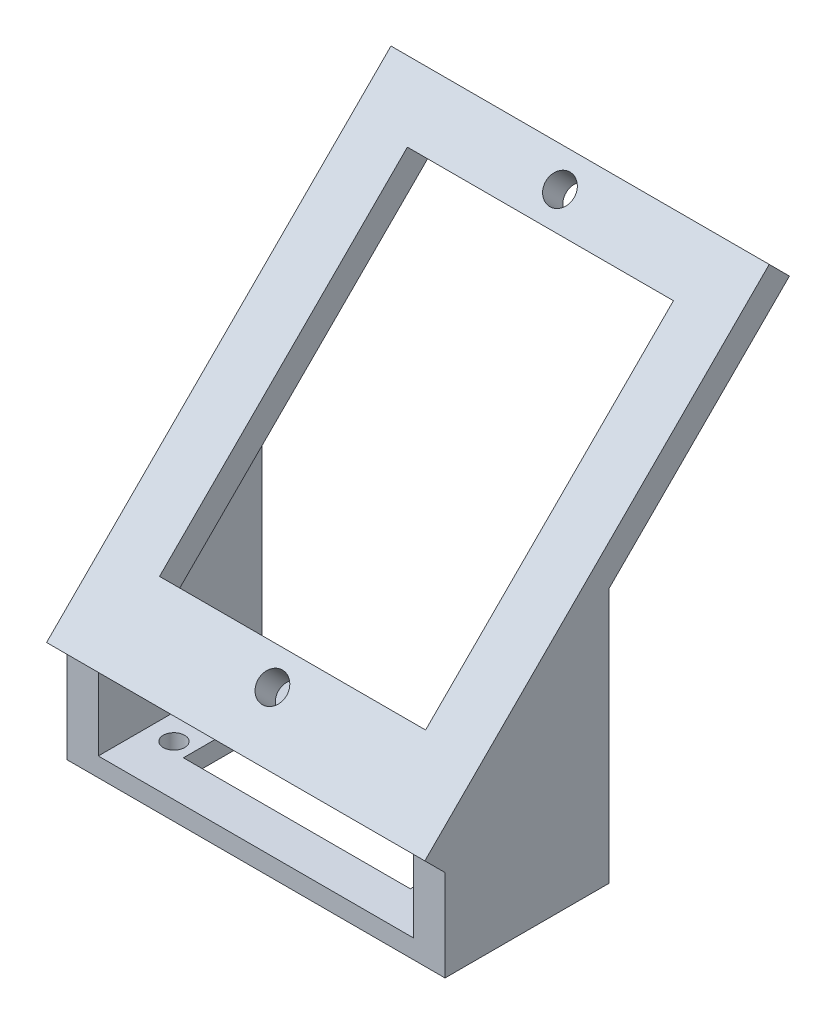
ISO-10303-21;
HEADER;
FILE_DESCRIPTION(('STEP AP214'),'2;1');
FILE_NAME('part.step','',(''),(''),'','','');
FILE_SCHEMA(('AUTOMOTIVE_DESIGN { 1 0 10303 214 1 1 1 1 }'));
ENDSEC;
DATA;
#1=APPLICATION_CONTEXT('core data for automotive mechanical design processes');
#2=APPLICATION_PROTOCOL_DEFINITION('international standard','automotive_design',2000,#1);
#3=PRODUCT_CONTEXT('',#1,'mechanical');
#4=PRODUCT('Part','Part','',(#3));
#5=PRODUCT_RELATED_PRODUCT_CATEGORY('part','',(#4));
#6=PRODUCT_DEFINITION_FORMATION('','',#4);
#7=PRODUCT_DEFINITION_CONTEXT('part definition',#1,'design');
#8=PRODUCT_DEFINITION('design','',#6,#7);
#9=PRODUCT_DEFINITION_SHAPE('','',#8);
#10=(LENGTH_UNIT() NAMED_UNIT(*) SI_UNIT(.MILLI.,.METRE.));
#11=(NAMED_UNIT(*) PLANE_ANGLE_UNIT() SI_UNIT($,.RADIAN.));
#12=(NAMED_UNIT(*) SI_UNIT($,.STERADIAN.) SOLID_ANGLE_UNIT());
#13=UNCERTAINTY_MEASURE_WITH_UNIT(LENGTH_MEASURE(1.E-05),#10,'distance_accuracy_value','');
#14=(GEOMETRIC_REPRESENTATION_CONTEXT(3) GLOBAL_UNCERTAINTY_ASSIGNED_CONTEXT((#13)) GLOBAL_UNIT_ASSIGNED_CONTEXT((#10,
#11,#12)) REPRESENTATION_CONTEXT('',''));
#15=CARTESIAN_POINT('',(0.,0.,0.));
#16=DIRECTION('',(0.,0.,1.));
#17=DIRECTION('',(1.,0.,0.));
#18=AXIS2_PLACEMENT_3D('',#15,#16,#17);
#19=CARTESIAN_POINT('',(-60.0114208535892,81.3180999237707,-16.383147730537));
#20=DIRECTION('',(0.,0.707106781186548,0.707106781186547));
#21=DIRECTION('',(0.,-0.707106781186547,0.707106781186548));
#22=AXIS2_PLACEMENT_3D('',#19,#20,#21);
#23=PLANE('',#22);
#24=DIRECTION('',(1.,0.,0.));
#25=VECTOR('',#24,1.);
#26=CARTESIAN_POINT('',(0.,75.0248495712104,-10.0898973779767));
#27=LINE('',#26,#25);
#28=CARTESIAN_POINT('',(-192.896406348332,75.0248495712104,-10.0898973779767));
#29=VERTEX_POINT('',#28);
#30=CARTESIAN_POINT('',(-150.696406348332,75.0248495712104,-10.0898973779768));
#31=VERTEX_POINT('',#30);
#32=EDGE_CURVE('E409',#29,#31,#27,.T.);
#33=ORIENTED_EDGE('',*,*,#32,.T.);
#34=DIRECTION('',(0.,-0.707106781186547,0.707106781186548));
#35=VECTOR('',#34,1.);
#36=CARTESIAN_POINT('',(-150.696406348332,32.4674760966169,32.4674760966169));
#37=LINE('',#36,#35);
#38=CARTESIAN_POINT('',(-150.696406348332,35.7097125372384,29.2252396559953));
#39=VERTEX_POINT('',#38);
#40=EDGE_CURVE('E402',#31,#39,#37,.T.);
#41=ORIENTED_EDGE('',*,*,#40,.T.);
#42=DIRECTION('',(1.,0.,0.));
#43=VECTOR('',#42,1.);
#44=CARTESIAN_POINT('',(0.,35.7097125372384,29.2252396559953));
#45=LINE('',#44,#43);
#46=CARTESIAN_POINT('',(-192.896406348332,35.7097125372384,29.2252396559953));
#47=VERTEX_POINT('',#46);
#48=EDGE_CURVE('E417',#47,#39,#45,.T.);
#49=ORIENTED_EDGE('',*,*,#48,.F.);
#50=DIRECTION('',(0.,0.707106781186547,-0.707106781186548));
#51=VECTOR('',#50,1.);
#52=CARTESIAN_POINT('',(-192.896406348332,32.4674760966169,32.4674760966169));
#53=LINE('',#52,#51);
#54=EDGE_CURVE('E413',#47,#29,#53,.T.);
#55=ORIENTED_EDGE('',*,*,#54,.T.);
#56=EDGE_LOOP('',(#33,#41,#49,#55));
#57=FACE_BOUND('',#56,.T.);
#58=DIRECTION('',(0.,0.707106781186547,-0.707106781186548));
#59=VECTOR('',#58,1.);
#60=CARTESIAN_POINT('',(-201.796406348332,81.3180999237707,-16.383147730537));
#61=LINE('',#60,#59);
#62=CARTESIAN_POINT('',(-201.796406348332,26.6905948829949,38.2443573102388));
#63=VERTEX_POINT('',#62);
#64=CARTESIAN_POINT('',(-201.796406348332,81.3180999237707,-16.383147730537));
#65=VERTEX_POINT('',#64);
#66=EDGE_CURVE('E242',#63,#65,#61,.T.);
#67=ORIENTED_EDGE('',*,*,#66,.F.);
#68=DIRECTION('',(-1.,0.,0.));
#69=VECTOR('',#68,1.);
#70=CARTESIAN_POINT('',(-60.0114208535892,26.6905948829949,38.2443573102388));
#71=LINE('',#70,#69);
#72=CARTESIAN_POINT('',(-141.796406348332,26.6905948829949,38.2443573102388));
#73=VERTEX_POINT('',#72);
#74=EDGE_CURVE('E260',#73,#63,#71,.T.);
#75=ORIENTED_EDGE('',*,*,#74,.F.);
#76=DIRECTION('',(0.,0.707106781186547,-0.707106781186548));
#77=VECTOR('',#76,1.);
#78=CARTESIAN_POINT('',(-141.796406348332,81.3180999237707,-16.383147730537));
#79=LINE('',#78,#77);
#80=CARTESIAN_POINT('',(-141.796406348332,81.3180999237707,-16.383147730537));
#81=VERTEX_POINT('',#80);
#82=EDGE_CURVE('E251',#73,#81,#79,.T.);
#83=ORIENTED_EDGE('',*,*,#82,.T.);
#84=DIRECTION('',(-1.,0.,0.));
#85=VECTOR('',#84,1.);
#86=CARTESIAN_POINT('',(-60.0114208535892,81.3180999237707,-16.383147730537));
#87=LINE('',#86,#85);
#88=EDGE_CURVE('E254',#81,#65,#87,.T.);
#89=ORIENTED_EDGE('',*,*,#88,.T.);
#90=EDGE_LOOP('',(#67,#75,#83,#89));
#91=FACE_BOUND('',#90,.T.);
#92=CARTESIAN_POINT('',(-171.844403564975,78.1714747474906,-13.2365225542569));
#93=DIRECTION('',(0.,0.707106781186548,0.707106781186547));
#94=DIRECTION('',(0.,-0.707106781186547,0.707106781186548));
#95=AXIS2_PLACEMENT_3D('',#92,#93,#94);
#96=CIRCLE('',#95,2.25000000000001);
#97=CARTESIAN_POINT('',(-171.844403564975,76.5804844898209,-11.6455322965872));
#98=VERTEX_POINT('',#97);
#99=EDGE_CURVE('E398',#98,#98,#96,.T.);
#100=ORIENTED_EDGE('',*,*,#99,.F.);
#101=EDGE_LOOP('',(#100));
#102=FACE_BOUND('',#101,.T.);
#103=CARTESIAN_POINT('',(-171.844403564975,32.5630873609583,32.3718648322754));
#104=DIRECTION('',(0.,-0.707106781186548,-0.707106781186547));
#105=DIRECTION('',(0.,0.707106781186547,-0.707106781186548));
#106=AXIS2_PLACEMENT_3D('',#103,#104,#105);
#107=CIRCLE('',#106,2.25000000000001);
#108=CARTESIAN_POINT('',(-171.844403564975,34.154077618628,30.7808745746057));
#109=VERTEX_POINT('',#108);
#110=EDGE_CURVE('E397',#109,#109,#107,.T.);
#111=ORIENTED_EDGE('',*,*,#110,.T.);
#112=EDGE_LOOP('',(#111));
#113=FACE_BOUND('',#112,.T.);
#114=ADVANCED_FACE('F45',(#57,#91,#102,#113),#23,.T.);
#115=CARTESIAN_POINT('',(-60.0114208535892,23.4873820811947,35.0411445084386));
#116=DIRECTION('',(0.,-0.707106781186547,-0.707106781186548));
#117=DIRECTION('',(0.,0.707106781186548,-0.707106781186547));
#118=AXIS2_PLACEMENT_3D('',#115,#116,#117);
#119=PLANE('',#118);
#120=DIRECTION('',(1.,0.,0.));
#121=VECTOR('',#120,1.);
#122=CARTESIAN_POINT('',(0.,49.4873820811948,9.04114450843855));
#123=LINE('',#122,#121);
#124=CARTESIAN_POINT('',(-146.796406348332,49.4873820811948,9.04114450843857));
#125=VERTEX_POINT('',#124);
#126=CARTESIAN_POINT('',(-141.796406348332,49.4873820811947,9.04114450843857));
#127=VERTEX_POINT('',#126);
#128=EDGE_CURVE('E202',#125,#127,#123,.T.);
#129=ORIENTED_EDGE('',*,*,#128,.F.);
#130=DIRECTION('',(0.,0.707106781186548,-0.707106781186547));
#131=VECTOR('',#130,1.);
#132=CARTESIAN_POINT('',(-146.796406348332,47.7436910405974,10.784835549036));
#133=LINE('',#132,#131);
#134=CARTESIAN_POINT('',(-146.796406348332,23.4873820811947,35.0411445084386));
#135=VERTEX_POINT('',#134);
#136=EDGE_CURVE('E216',#135,#125,#133,.T.);
#137=ORIENTED_EDGE('',*,*,#136,.F.);
#138=DIRECTION('',(-1.,0.,0.));
#139=VECTOR('',#138,1.);
#140=CARTESIAN_POINT('',(-60.0114208535892,23.4873820811947,35.0411445084386));
#141=LINE('',#140,#139);
#142=CARTESIAN_POINT('',(-196.796406348332,23.4873820811947,35.0411445084386));
#143=VERTEX_POINT('',#142);
#144=EDGE_CURVE('E274',#135,#143,#141,.T.);
#145=ORIENTED_EDGE('',*,*,#144,.T.);
#146=DIRECTION('',(0.,-0.707106781186548,0.707106781186547));
#147=VECTOR('',#146,1.);
#148=CARTESIAN_POINT('',(-196.796406348332,47.7436910405974,10.7848355490359));
#149=LINE('',#148,#147);
#150=CARTESIAN_POINT('',(-196.796406348332,49.4873820811947,9.04114450843857));
#151=VERTEX_POINT('',#150);
#152=EDGE_CURVE('E286',#151,#143,#149,.T.);
#153=ORIENTED_EDGE('',*,*,#152,.F.);
#154=CARTESIAN_POINT('',(-201.796406348332,49.4873820811947,9.04114450843858));
#155=VERTEX_POINT('',#154);
#156=EDGE_CURVE('E285',#155,#151,#123,.T.);
#157=ORIENTED_EDGE('',*,*,#156,.F.);
#158=DIRECTION('',(0.,-0.707106781186548,0.707106781186547));
#159=VECTOR('',#158,1.);
#160=CARTESIAN_POINT('',(-201.796406348332,23.4873820811947,35.0411445084386));
#161=LINE('',#160,#159);
#162=CARTESIAN_POINT('',(-201.796406348332,78.1148871219705,-19.5863605323372));
#163=VERTEX_POINT('',#162);
#164=EDGE_CURVE('E255',#163,#155,#161,.T.);
#165=ORIENTED_EDGE('',*,*,#164,.F.);
#166=DIRECTION('',(-1.,0.,0.));
#167=VECTOR('',#166,1.);
#168=CARTESIAN_POINT('',(-60.0114208535892,78.1148871219705,-19.5863605323372));
#169=LINE('',#168,#167);
#170=CARTESIAN_POINT('',(-141.796406348332,78.1148871219705,-19.5863605323372));
#171=VERTEX_POINT('',#170);
#172=EDGE_CURVE('E266',#171,#163,#169,.T.);
#173=ORIENTED_EDGE('',*,*,#172,.F.);
#174=DIRECTION('',(0.,-0.707106781186548,0.707106781186547));
#175=VECTOR('',#174,1.);
#176=CARTESIAN_POINT('',(-141.796406348332,23.4873820811947,35.0411445084386));
#177=LINE('',#176,#175);
#178=EDGE_CURVE('E262',#171,#127,#177,.T.);
#179=ORIENTED_EDGE('',*,*,#178,.T.);
#180=EDGE_LOOP('',(#129,#137,#145,#153,#157,#165,#173,#179));
#181=FACE_BOUND('',#180,.T.);
#182=DIRECTION('',(-1.,0.,0.));
#183=VECTOR('',#182,1.);
#184=CARTESIAN_POINT('',(-60.0114208535892,32.5064997354382,26.0220268541951));
#185=LINE('',#184,#183);
#186=CARTESIAN_POINT('',(-150.696406348332,32.5064997354382,26.0220268541951));
#187=VERTEX_POINT('',#186);
#188=CARTESIAN_POINT('',(-192.896406348332,32.5064997354382,26.0220268541951));
#189=VERTEX_POINT('',#188);
#190=EDGE_CURVE('E55',#187,#189,#185,.T.);
#191=ORIENTED_EDGE('',*,*,#190,.F.);
#192=DIRECTION('',(0.,0.707106781186548,-0.707106781186547));
#193=VECTOR('',#192,1.);
#194=CARTESIAN_POINT('',(-150.696406348332,23.4873820811947,35.0411445084386));
#195=LINE('',#194,#193);
#196=CARTESIAN_POINT('',(-150.696406348332,71.8216367694102,-13.2931101797769));
#197=VERTEX_POINT('',#196);
#198=EDGE_CURVE('E11',#187,#197,#195,.T.);
#199=ORIENTED_EDGE('',*,*,#198,.T.);
#200=DIRECTION('',(-1.,0.,0.));
#201=VECTOR('',#200,1.);
#202=CARTESIAN_POINT('',(-60.0114208535892,71.8216367694102,-13.2931101797769));
#203=LINE('',#202,#201);
#204=CARTESIAN_POINT('',(-192.896406348332,71.8216367694102,-13.2931101797769));
#205=VERTEX_POINT('',#204);
#206=EDGE_CURVE('E219',#197,#205,#203,.T.);
#207=ORIENTED_EDGE('',*,*,#206,.T.);
#208=DIRECTION('',(0.,-0.707106781186548,0.707106781186547));
#209=VECTOR('',#208,1.);
#210=CARTESIAN_POINT('',(-192.896406348332,23.4873820811947,35.0411445084386));
#211=LINE('',#210,#209);
#212=EDGE_CURVE('E224',#205,#189,#211,.T.);
#213=ORIENTED_EDGE('',*,*,#212,.T.);
#214=EDGE_LOOP('',(#191,#199,#207,#213));
#215=FACE_BOUND('',#214,.T.);
#216=CARTESIAN_POINT('',(-171.844403564975,74.9682619456904,-16.4397353560571));
#217=DIRECTION('',(0.,-0.707106781186547,-0.707106781186548));
#218=DIRECTION('',(0.,0.707106781186548,-0.707106781186547));
#219=AXIS2_PLACEMENT_3D('',#216,#217,#218);
#220=CIRCLE('',#219,2.25000000000001);
#221=CARTESIAN_POINT('',(-171.844403564975,76.5592522033601,-18.0307256137268));
#222=VERTEX_POINT('',#221);
#223=EDGE_CURVE('E230',#222,#222,#220,.T.);
#224=ORIENTED_EDGE('',*,*,#223,.F.);
#225=EDGE_LOOP('',(#224));
#226=FACE_BOUND('',#225,.T.);
#227=CARTESIAN_POINT('',(-171.844403564975,29.3598745591581,29.1686520304752));
#228=DIRECTION('',(0.,-0.707106781186547,-0.707106781186548));
#229=DIRECTION('',(0.,0.707106781186548,-0.707106781186547));
#230=AXIS2_PLACEMENT_3D('',#227,#228,#229);
#231=CIRCLE('',#230,2.25000000000001);
#232=CARTESIAN_POINT('',(-171.844403564975,30.9508648168278,27.5776617728055));
#233=VERTEX_POINT('',#232);
#234=EDGE_CURVE('E233',#233,#233,#231,.F.);
#235=ORIENTED_EDGE('',*,*,#234,.T.);
#236=EDGE_LOOP('',(#235));
#237=FACE_BOUND('',#236,.T.);
#238=ADVANCED_FACE('F442',(#181,#215,#226,#237),#119,.T.);
#239=CARTESIAN_POINT('',(-141.796406348332,12.,0.));
#240=DIRECTION('',(1.,0.,0.));
#241=DIRECTION('',(0.,0.,-1.));
#242=AXIS2_PLACEMENT_3D('',#239,#240,#241);
#243=PLANE('',#242);
#244=DIRECTION('',(0.,0.,1.));
#245=VECTOR('',#244,1.);
#246=CARTESIAN_POINT('',(-141.796406348332,9.,9.0411445084386));
#247=LINE('',#246,#245);
#248=CARTESIAN_POINT('',(-141.796406348332,9.,9.0411445084386));
#249=VERTEX_POINT('',#248);
#250=CARTESIAN_POINT('',(-141.796406348332,9.,35.0411445084386));
#251=VERTEX_POINT('',#250);
#252=EDGE_CURVE('E71',#249,#251,#247,.T.);
#253=ORIENTED_EDGE('',*,*,#252,.F.);
#254=DIRECTION('',(0.,-1.,0.));
#255=VECTOR('',#254,1.);
#256=CARTESIAN_POINT('',(-141.796406348332,12.,9.04114450843857));
#257=LINE('',#256,#255);
#258=EDGE_CURVE('E193',#127,#249,#257,.T.);
#259=ORIENTED_EDGE('',*,*,#258,.F.);
#260=ORIENTED_EDGE('',*,*,#178,.F.);
#261=DIRECTION('',(0.,-0.707106781186548,-0.707106781186547));
#262=VECTOR('',#261,1.);
#263=CARTESIAN_POINT('',(-141.796406348332,78.1148871219705,-19.5863605323372));
#264=LINE('',#263,#262);
#265=EDGE_CURVE('E267',#81,#171,#264,.T.);
#266=ORIENTED_EDGE('',*,*,#265,.F.);
#267=ORIENTED_EDGE('',*,*,#82,.F.);
#268=DIRECTION('',(0.,0.707106781186548,0.707106781186548));
#269=VECTOR('',#268,1.);
#270=CARTESIAN_POINT('',(-141.796406348332,26.6905948829949,38.2443573102388));
#271=LINE('',#270,#269);
#272=CARTESIAN_POINT('',(-141.796406348332,23.4873820811947,35.0411445084386));
#273=VERTEX_POINT('',#272);
#274=EDGE_CURVE('E256',#273,#73,#271,.T.);
#275=ORIENTED_EDGE('',*,*,#274,.F.);
#276=DIRECTION('',(0.,-1.,0.));
#277=VECTOR('',#276,1.);
#278=CARTESIAN_POINT('',(-141.796406348332,12.,35.0411445084386));
#279=LINE('',#278,#277);
#280=EDGE_CURVE('E195',#273,#251,#279,.T.);
#281=ORIENTED_EDGE('',*,*,#280,.T.);
#282=EDGE_LOOP('',(#253,#259,#260,#266,#267,#275,#281));
#283=FACE_BOUND('',#282,.T.);
#284=ADVANCED_FACE('F192',(#283),#243,.T.);
#285=CARTESIAN_POINT('',(-201.796406348332,12.,0.));
#286=DIRECTION('',(1.,0.,0.));
#287=DIRECTION('',(0.,0.,-1.));
#288=AXIS2_PLACEMENT_3D('',#285,#286,#287);
#289=PLANE('',#288);
#290=DIRECTION('',(0.,-1.,0.));
#291=VECTOR('',#290,1.);
#292=CARTESIAN_POINT('',(-201.796406348332,12.,9.04114450843857));
#293=LINE('',#292,#291);
#294=CARTESIAN_POINT('',(-201.796406348332,9.,9.0411445084386));
#295=VERTEX_POINT('',#294);
#296=EDGE_CURVE('E205',#155,#295,#293,.T.);
#297=ORIENTED_EDGE('',*,*,#296,.T.);
#298=DIRECTION('',(0.,0.,1.));
#299=VECTOR('',#298,1.);
#300=CARTESIAN_POINT('',(-201.796406348332,9.,9.0411445084386));
#301=LINE('',#300,#299);
#302=CARTESIAN_POINT('',(-201.796406348332,9.,35.0411445084386));
#303=VERTEX_POINT('',#302);
#304=EDGE_CURVE('E181',#295,#303,#301,.T.);
#305=ORIENTED_EDGE('',*,*,#304,.T.);
#306=DIRECTION('',(0.,-1.,0.));
#307=VECTOR('',#306,1.);
#308=CARTESIAN_POINT('',(-201.796406348332,12.,35.0411445084386));
#309=LINE('',#308,#307);
#310=CARTESIAN_POINT('',(-201.796406348332,23.4873820811947,35.0411445084386));
#311=VERTEX_POINT('',#310);
#312=EDGE_CURVE('E212',#311,#303,#309,.T.);
#313=ORIENTED_EDGE('',*,*,#312,.F.);
#314=DIRECTION('',(0.,0.707106781186548,0.707106781186548));
#315=VECTOR('',#314,1.);
#316=CARTESIAN_POINT('',(-201.796406348332,26.6905948829949,38.2443573102388));
#317=LINE('',#316,#315);
#318=EDGE_CURVE('E237',#311,#63,#317,.T.);
#319=ORIENTED_EDGE('',*,*,#318,.T.);
#320=ORIENTED_EDGE('',*,*,#66,.T.);
#321=DIRECTION('',(0.,-0.707106781186548,-0.707106781186547));
#322=VECTOR('',#321,1.);
#323=CARTESIAN_POINT('',(-201.796406348332,78.1148871219705,-19.5863605323372));
#324=LINE('',#323,#322);
#325=EDGE_CURVE('E247',#65,#163,#324,.T.);
#326=ORIENTED_EDGE('',*,*,#325,.T.);
#327=ORIENTED_EDGE('',*,*,#164,.T.);
#328=EDGE_LOOP('',(#297,#305,#313,#319,#320,#326,#327));
#329=FACE_BOUND('',#328,.T.);
#330=ADVANCED_FACE('F365',(#329),#289,.F.);
#331=CARTESIAN_POINT('',(0.,12.,0.));
#332=DIRECTION('',(0.,1.,0.));
#333=DIRECTION('',(0.,0.,1.));
#334=AXIS2_PLACEMENT_3D('',#331,#332,#333);
#335=PLANE('',#334);
#336=DIRECTION('',(-1.,0.,0.));
#337=VECTOR('',#336,1.);
#338=CARTESIAN_POINT('',(0.,12.,35.0411445084386));
#339=LINE('',#338,#337);
#340=CARTESIAN_POINT('',(-146.796406348332,12.,35.0411445084386));
#341=VERTEX_POINT('',#340);
#342=CARTESIAN_POINT('',(-196.796406348332,12.,35.0411445084386));
#343=VERTEX_POINT('',#342);
#344=EDGE_CURVE('E330',#341,#343,#339,.T.);
#345=ORIENTED_EDGE('',*,*,#344,.F.);
#346=DIRECTION('',(0.,0.,1.));
#347=VECTOR('',#346,1.);
#348=CARTESIAN_POINT('',(-146.796406348332,12.,9.04114450843857));
#349=LINE('',#348,#347);
#350=CARTESIAN_POINT('',(-146.796406348332,12.,9.04114450843857));
#351=VERTEX_POINT('',#350);
#352=EDGE_CURVE('E297',#351,#341,#349,.T.);
#353=ORIENTED_EDGE('',*,*,#352,.F.);
#354=DIRECTION('',(-1.,0.,0.));
#355=VECTOR('',#354,1.);
#356=CARTESIAN_POINT('',(0.,12.,9.04114450843855));
#357=LINE('',#356,#355);
#358=CARTESIAN_POINT('',(-196.796406348332,12.,9.04114450843857));
#359=VERTEX_POINT('',#358);
#360=EDGE_CURVE('E326',#351,#359,#357,.T.);
#361=ORIENTED_EDGE('',*,*,#360,.T.);
#362=DIRECTION('',(0.,0.,-1.));
#363=VECTOR('',#362,1.);
#364=CARTESIAN_POINT('',(-196.796406348332,12.,35.0411445084386));
#365=LINE('',#364,#363);
#366=EDGE_CURVE('E304',#343,#359,#365,.T.);
#367=ORIENTED_EDGE('',*,*,#366,.F.);
#368=EDGE_LOOP('',(#345,#353,#361,#367));
#369=FACE_BOUND('',#368,.T.);
#370=CARTESIAN_POINT('',(-150.796406348332,12.,17.0411445084386));
#371=DIRECTION('',(0.,1.,0.));
#372=DIRECTION('',(0.,0.,1.));
#373=AXIS2_PLACEMENT_3D('',#370,#371,#372);
#374=CIRCLE('',#373,1.70000000000001);
#375=CARTESIAN_POINT('',(-150.796406348332,12.,18.7411445084386));
#376=VERTEX_POINT('',#375);
#377=EDGE_CURVE('E310',#376,#376,#374,.F.);
#378=ORIENTED_EDGE('',*,*,#377,.T.);
#379=EDGE_LOOP('',(#378));
#380=FACE_BOUND('',#379,.T.);
#381=CARTESIAN_POINT('',(-150.796406348332,12.,27.0411445084386));
#382=DIRECTION('',(0.,1.,0.));
#383=DIRECTION('',(0.,0.,1.));
#384=AXIS2_PLACEMENT_3D('',#381,#382,#383);
#385=CIRCLE('',#384,1.70000000000001);
#386=CARTESIAN_POINT('',(-150.796406348332,12.,28.7411445084386));
#387=VERTEX_POINT('',#386);
#388=EDGE_CURVE('E314',#387,#387,#385,.F.);
#389=ORIENTED_EDGE('',*,*,#388,.T.);
#390=EDGE_LOOP('',(#389));
#391=FACE_BOUND('',#390,.T.);
#392=CARTESIAN_POINT('',(-192.796406348332,12.,27.0411445084386));
#393=DIRECTION('',(0.,1.,0.));
#394=DIRECTION('',(0.,0.,1.));
#395=AXIS2_PLACEMENT_3D('',#392,#393,#394);
#396=CIRCLE('',#395,1.70000000000001);
#397=CARTESIAN_POINT('',(-192.796406348332,12.,28.7411445084386));
#398=VERTEX_POINT('',#397);
#399=EDGE_CURVE('E318',#398,#398,#396,.T.);
#400=ORIENTED_EDGE('',*,*,#399,.F.);
#401=EDGE_LOOP('',(#400));
#402=FACE_BOUND('',#401,.T.);
#403=CARTESIAN_POINT('',(-192.796406348332,12.,17.0411445084386));
#404=DIRECTION('',(0.,1.,0.));
#405=DIRECTION('',(0.,0.,1.));
#406=AXIS2_PLACEMENT_3D('',#403,#404,#405);
#407=CIRCLE('',#406,1.70000000000001);
#408=CARTESIAN_POINT('',(-192.796406348332,12.,18.7411445084386));
#409=VERTEX_POINT('',#408);
#410=EDGE_CURVE('E322',#409,#409,#407,.T.);
#411=ORIENTED_EDGE('',*,*,#410,.F.);
#412=EDGE_LOOP('',(#411));
#413=FACE_BOUND('',#412,.T.);
#414=DIRECTION('',(1.,0.,0.));
#415=VECTOR('',#414,1.);
#416=CARTESIAN_POINT('',(0.,12.,28.5411445084386));
#417=LINE('',#416,#415);
#418=CARTESIAN_POINT('',(-189.796406348332,12.,28.5411445084386));
#419=VERTEX_POINT('',#418);
#420=CARTESIAN_POINT('',(-153.796406348332,12.,28.5411445084386));
#421=VERTEX_POINT('',#420);
#422=EDGE_CURVE('E334',#419,#421,#417,.T.);
#423=ORIENTED_EDGE('',*,*,#422,.F.);
#424=DIRECTION('',(0.,0.,-1.));
#425=VECTOR('',#424,1.);
#426=CARTESIAN_POINT('',(-189.796406348332,12.,0.));
#427=LINE('',#426,#425);
#428=CARTESIAN_POINT('',(-189.796406348332,12.,15.5411445084386));
#429=VERTEX_POINT('',#428);
#430=EDGE_CURVE('E338',#419,#429,#427,.T.);
#431=ORIENTED_EDGE('',*,*,#430,.T.);
#432=DIRECTION('',(-1.,0.,0.));
#433=VECTOR('',#432,1.);
#434=CARTESIAN_POINT('',(0.,12.,15.5411445084378));
#435=LINE('',#434,#433);
#436=CARTESIAN_POINT('',(-153.796406348332,12.,15.5411445084386));
#437=VERTEX_POINT('',#436);
#438=EDGE_CURVE('E341',#437,#429,#435,.T.);
#439=ORIENTED_EDGE('',*,*,#438,.F.);
#440=DIRECTION('',(0.,0.,1.));
#441=VECTOR('',#440,1.);
#442=CARTESIAN_POINT('',(-153.796406348332,12.,0.));
#443=LINE('',#442,#441);
#444=EDGE_CURVE('E345',#437,#421,#443,.T.);
#445=ORIENTED_EDGE('',*,*,#444,.T.);
#446=EDGE_LOOP('',(#423,#431,#439,#445));
#447=FACE_BOUND('',#446,.T.);
#448=ADVANCED_FACE('F460',(#369,#380,#391,#402,#413,#447),#335,.T.);
#449=CARTESIAN_POINT('',(0.,12.,28.5411445084386));
#450=DIRECTION('',(0.,0.,-1.));
#451=DIRECTION('',(-1.,0.,0.));
#452=AXIS2_PLACEMENT_3D('',#449,#450,#451);
#453=PLANE('',#452);
#454=DIRECTION('',(1.,0.,0.));
#455=VECTOR('',#454,1.);
#456=CARTESIAN_POINT('',(0.,9.,28.5411445084386));
#457=LINE('',#456,#455);
#458=CARTESIAN_POINT('',(-189.796406348332,9.,28.5411445084386));
#459=VERTEX_POINT('',#458);
#460=CARTESIAN_POINT('',(-153.796406348332,9.,28.5411445084386));
#461=VERTEX_POINT('',#460);
#462=EDGE_CURVE('E63',#459,#461,#457,.T.);
#463=ORIENTED_EDGE('',*,*,#462,.F.);
#464=DIRECTION('',(0.,-1.,0.));
#465=VECTOR('',#464,1.);
#466=CARTESIAN_POINT('',(-189.796406348332,12.,28.5411445084386));
#467=LINE('',#466,#465);
#468=EDGE_CURVE('E220',#419,#459,#467,.T.);
#469=ORIENTED_EDGE('',*,*,#468,.F.);
#470=ORIENTED_EDGE('',*,*,#422,.T.);
#471=DIRECTION('',(0.,-1.,0.));
#472=VECTOR('',#471,1.);
#473=CARTESIAN_POINT('',(-153.796406348332,12.,28.5411445084386));
#474=LINE('',#473,#472);
#475=EDGE_CURVE('E204',#421,#461,#474,.T.);
#476=ORIENTED_EDGE('',*,*,#475,.T.);
#477=EDGE_LOOP('',(#463,#469,#470,#476));
#478=FACE_BOUND('',#477,.T.);
#479=ADVANCED_FACE('F496',(#478),#453,.T.);
#480=CARTESIAN_POINT('',(-189.796406348332,12.,0.));
#481=DIRECTION('',(-1.,0.,0.));
#482=DIRECTION('',(0.,0.,1.));
#483=AXIS2_PLACEMENT_3D('',#480,#481,#482);
#484=PLANE('',#483);
#485=ORIENTED_EDGE('',*,*,#468,.T.);
#486=DIRECTION('',(0.,0.,-1.));
#487=VECTOR('',#486,1.);
#488=CARTESIAN_POINT('',(-189.796406348332,9.,0.));
#489=LINE('',#488,#487);
#490=CARTESIAN_POINT('',(-189.796406348332,9.,15.5411445084386));
#491=VERTEX_POINT('',#490);
#492=EDGE_CURVE('E391',#459,#491,#489,.T.);
#493=ORIENTED_EDGE('',*,*,#492,.T.);
#494=DIRECTION('',(0.,-1.,0.));
#495=VECTOR('',#494,1.);
#496=CARTESIAN_POINT('',(-189.796406348332,12.,15.5411445084386));
#497=LINE('',#496,#495);
#498=EDGE_CURVE('E351',#429,#491,#497,.T.);
#499=ORIENTED_EDGE('',*,*,#498,.F.);
#500=ORIENTED_EDGE('',*,*,#430,.F.);
#501=EDGE_LOOP('',(#485,#493,#499,#500));
#502=FACE_BOUND('',#501,.T.);
#503=ADVANCED_FACE('F504',(#502),#484,.F.);
#504=CARTESIAN_POINT('',(0.,12.,15.5411445084378));
#505=DIRECTION('',(0.,0.,1.));
#506=DIRECTION('',(1.,0.,0.));
#507=AXIS2_PLACEMENT_3D('',#504,#505,#506);
#508=PLANE('',#507);
#509=DIRECTION('',(-1.,0.,0.));
#510=VECTOR('',#509,1.);
#511=CARTESIAN_POINT('',(0.,9.,15.5411445084378));
#512=LINE('',#511,#510);
#513=CARTESIAN_POINT('',(-153.796406348332,9.,15.5411445084386));
#514=VERTEX_POINT('',#513);
#515=EDGE_CURVE('E388',#514,#491,#512,.T.);
#516=ORIENTED_EDGE('',*,*,#515,.F.);
#517=DIRECTION('',(0.,-1.,0.));
#518=VECTOR('',#517,1.);
#519=CARTESIAN_POINT('',(-153.796406348332,12.,15.5411445084386));
#520=LINE('',#519,#518);
#521=EDGE_CURVE('E210',#437,#514,#520,.T.);
#522=ORIENTED_EDGE('',*,*,#521,.F.);
#523=ORIENTED_EDGE('',*,*,#438,.T.);
#524=ORIENTED_EDGE('',*,*,#498,.T.);
#525=EDGE_LOOP('',(#516,#522,#523,#524));
#526=FACE_BOUND('',#525,.T.);
#527=ADVANCED_FACE('F501',(#526),#508,.T.);
#528=CARTESIAN_POINT('',(0.,12.,9.04114450843855));
#529=DIRECTION('',(0.,0.,1.));
#530=DIRECTION('',(1.,0.,0.));
#531=AXIS2_PLACEMENT_3D('',#528,#529,#530);
#532=PLANE('',#531);
#533=ORIENTED_EDGE('',*,*,#258,.T.);
#534=DIRECTION('',(-1.,0.,0.));
#535=VECTOR('',#534,1.);
#536=CARTESIAN_POINT('',(-201.796406348332,9.,9.0411445084386));
#537=LINE('',#536,#535);
#538=EDGE_CURVE('E177',#249,#295,#537,.T.);
#539=ORIENTED_EDGE('',*,*,#538,.T.);
#540=ORIENTED_EDGE('',*,*,#296,.F.);
#541=ORIENTED_EDGE('',*,*,#156,.T.);
#542=DIRECTION('',(0.,-1.,0.));
#543=VECTOR('',#542,1.);
#544=CARTESIAN_POINT('',(-196.796406348332,72.,9.04114450843857));
#545=LINE('',#544,#543);
#546=EDGE_CURVE('E300',#151,#359,#545,.T.);
#547=ORIENTED_EDGE('',*,*,#546,.T.);
#548=ORIENTED_EDGE('',*,*,#360,.F.);
#549=DIRECTION('',(0.,-1.,0.));
#550=VECTOR('',#549,1.);
#551=CARTESIAN_POINT('',(-146.796406348332,72.,9.04114450843857));
#552=LINE('',#551,#550);
#553=EDGE_CURVE('E294',#125,#351,#552,.T.);
#554=ORIENTED_EDGE('',*,*,#553,.F.);
#555=ORIENTED_EDGE('',*,*,#128,.T.);
#556=EDGE_LOOP('',(#533,#539,#540,#541,#547,#548,#554,#555));
#557=FACE_BOUND('',#556,.T.);
#558=ADVANCED_FACE('F199',(#557),#532,.F.);
#559=CARTESIAN_POINT('',(-153.796406348332,12.,0.));
#560=DIRECTION('',(1.,0.,0.));
#561=DIRECTION('',(0.,0.,-1.));
#562=AXIS2_PLACEMENT_3D('',#559,#560,#561);
#563=PLANE('',#562);
#564=ORIENTED_EDGE('',*,*,#521,.T.);
#565=DIRECTION('',(0.,0.,1.));
#566=VECTOR('',#565,1.);
#567=CARTESIAN_POINT('',(-153.796406348332,9.,0.));
#568=LINE('',#567,#566);
#569=EDGE_CURVE('E385',#514,#461,#568,.T.);
#570=ORIENTED_EDGE('',*,*,#569,.T.);
#571=ORIENTED_EDGE('',*,*,#475,.F.);
#572=ORIENTED_EDGE('',*,*,#444,.F.);
#573=EDGE_LOOP('',(#564,#570,#571,#572));
#574=FACE_BOUND('',#573,.T.);
#575=ADVANCED_FACE('F497',(#574),#563,.F.);
#576=CARTESIAN_POINT('',(0.,12.,35.0411445084386));
#577=DIRECTION('',(0.,0.,1.));
#578=DIRECTION('',(1.,0.,0.));
#579=AXIS2_PLACEMENT_3D('',#576,#577,#578);
#580=PLANE('',#579);
#581=DIRECTION('',(-1.,0.,0.));
#582=VECTOR('',#581,1.);
#583=CARTESIAN_POINT('',(-201.796406348332,9.,35.0411445084386));
#584=LINE('',#583,#582);
#585=EDGE_CURVE('E187',#251,#303,#584,.T.);
#586=ORIENTED_EDGE('',*,*,#585,.F.);
#587=ORIENTED_EDGE('',*,*,#280,.F.);
#588=EDGE_CURVE('E261',#273,#135,#141,.T.);
#589=ORIENTED_EDGE('',*,*,#588,.T.);
#590=DIRECTION('',(0.,-1.,0.));
#591=VECTOR('',#590,1.);
#592=CARTESIAN_POINT('',(-146.796406348332,72.,35.0411445084386));
#593=LINE('',#592,#591);
#594=EDGE_CURVE('E290',#135,#341,#593,.T.);
#595=ORIENTED_EDGE('',*,*,#594,.T.);
#596=ORIENTED_EDGE('',*,*,#344,.T.);
#597=DIRECTION('',(0.,-1.,0.));
#598=VECTOR('',#597,1.);
#599=CARTESIAN_POINT('',(-196.796406348332,72.,35.0411445084386));
#600=LINE('',#599,#598);
#601=EDGE_CURVE('E307',#143,#343,#600,.T.);
#602=ORIENTED_EDGE('',*,*,#601,.F.);
#603=EDGE_CURVE('E265',#143,#311,#141,.T.);
#604=ORIENTED_EDGE('',*,*,#603,.T.);
#605=ORIENTED_EDGE('',*,*,#312,.T.);
#606=EDGE_LOOP('',(#586,#587,#589,#595,#596,#602,#604,#605));
#607=FACE_BOUND('',#606,.T.);
#608=ADVANCED_FACE('F363',(#607),#580,.T.);
#609=CARTESIAN_POINT('',(-192.796406348332,12.,17.0411445084386));
#610=DIRECTION('',(0.,-1.,0.));
#611=DIRECTION('',(0.,0.,-1.));
#612=AXIS2_PLACEMENT_3D('',#609,#610,#611);
#613=CYLINDRICAL_SURFACE('',#612,1.70000000000001);
#614=CARTESIAN_POINT('',(-192.796406348332,9.,17.0411445084386));
#615=DIRECTION('',(0.,1.,0.));
#616=DIRECTION('',(0.,0.,1.));
#617=AXIS2_PLACEMENT_3D('',#614,#615,#616);
#618=CIRCLE('',#617,1.70000000000001);
#619=CARTESIAN_POINT('',(-192.796406348332,9.,18.7411445084386));
#620=VERTEX_POINT('',#619);
#621=EDGE_CURVE('E381',#620,#620,#618,.T.);
#622=ORIENTED_EDGE('',*,*,#621,.F.);
#623=EDGE_LOOP('',(#622));
#624=FACE_BOUND('',#623,.T.);
#625=ORIENTED_EDGE('',*,*,#410,.T.);
#626=EDGE_LOOP('',(#625));
#627=FACE_BOUND('',#626,.T.);
#628=ADVANCED_FACE('F514',(#624,#627),#613,.F.);
#629=CARTESIAN_POINT('',(-192.796406348332,12.,27.0411445084386));
#630=DIRECTION('',(0.,-1.,0.));
#631=DIRECTION('',(0.,0.,-1.));
#632=AXIS2_PLACEMENT_3D('',#629,#630,#631);
#633=CYLINDRICAL_SURFACE('',#632,1.70000000000001);
#634=CARTESIAN_POINT('',(-192.796406348332,9.,27.0411445084386));
#635=DIRECTION('',(0.,1.,0.));
#636=DIRECTION('',(0.,0.,1.));
#637=AXIS2_PLACEMENT_3D('',#634,#635,#636);
#638=CIRCLE('',#637,1.70000000000001);
#639=CARTESIAN_POINT('',(-192.796406348332,9.,28.7411445084386));
#640=VERTEX_POINT('',#639);
#641=EDGE_CURVE('E377',#640,#640,#638,.T.);
#642=ORIENTED_EDGE('',*,*,#641,.F.);
#643=EDGE_LOOP('',(#642));
#644=FACE_BOUND('',#643,.T.);
#645=ORIENTED_EDGE('',*,*,#399,.T.);
#646=EDGE_LOOP('',(#645));
#647=FACE_BOUND('',#646,.T.);
#648=ADVANCED_FACE('F523',(#644,#647),#633,.F.);
#649=CARTESIAN_POINT('',(-150.796406348332,12.,27.0411445084386));
#650=DIRECTION('',(0.,-1.,0.));
#651=DIRECTION('',(0.,0.,-1.));
#652=AXIS2_PLACEMENT_3D('',#649,#650,#651);
#653=CYLINDRICAL_SURFACE('',#652,1.70000000000001);
#654=CARTESIAN_POINT('',(-150.796406348332,9.,27.0411445084386));
#655=DIRECTION('',(0.,1.,0.));
#656=DIRECTION('',(0.,0.,1.));
#657=AXIS2_PLACEMENT_3D('',#654,#655,#656);
#658=CIRCLE('',#657,1.70000000000001);
#659=CARTESIAN_POINT('',(-150.796406348332,9.,28.7411445084386));
#660=VERTEX_POINT('',#659);
#661=EDGE_CURVE('E371',#660,#660,#658,.F.);
#662=ORIENTED_EDGE('',*,*,#661,.T.);
#663=EDGE_LOOP('',(#662));
#664=FACE_BOUND('',#663,.T.);
#665=ORIENTED_EDGE('',*,*,#388,.F.);
#666=EDGE_LOOP('',(#665));
#667=FACE_BOUND('',#666,.T.);
#668=ADVANCED_FACE('F526',(#664,#667),#653,.F.);
#669=CARTESIAN_POINT('',(-150.796406348332,12.,17.0411445084386));
#670=DIRECTION('',(0.,-1.,0.));
#671=DIRECTION('',(0.,0.,-1.));
#672=AXIS2_PLACEMENT_3D('',#669,#670,#671);
#673=CYLINDRICAL_SURFACE('',#672,1.70000000000001);
#674=CARTESIAN_POINT('',(-150.796406348332,9.,17.0411445084386));
#675=DIRECTION('',(0.,1.,0.));
#676=DIRECTION('',(0.,0.,1.));
#677=AXIS2_PLACEMENT_3D('',#674,#675,#676);
#678=CIRCLE('',#677,1.70000000000001);
#679=CARTESIAN_POINT('',(-150.796406348332,9.,18.7411445084386));
#680=VERTEX_POINT('',#679);
#681=EDGE_CURVE('E49',#680,#680,#678,.F.);
#682=ORIENTED_EDGE('',*,*,#681,.T.);
#683=EDGE_LOOP('',(#682));
#684=FACE_BOUND('',#683,.T.);
#685=ORIENTED_EDGE('',*,*,#377,.F.);
#686=EDGE_LOOP('',(#685));
#687=FACE_BOUND('',#686,.T.);
#688=ADVANCED_FACE('F47',(#684,#687),#673,.F.);
#689=CARTESIAN_POINT('',(-196.796406348332,72.,35.0411445084386));
#690=DIRECTION('',(-1.,0.,0.));
#691=DIRECTION('',(0.,0.,1.));
#692=AXIS2_PLACEMENT_3D('',#689,#690,#691);
#693=PLANE('',#692);
#694=ORIENTED_EDGE('',*,*,#366,.T.);
#695=ORIENTED_EDGE('',*,*,#546,.F.);
#696=ORIENTED_EDGE('',*,*,#152,.T.);
#697=ORIENTED_EDGE('',*,*,#601,.T.);
#698=EDGE_LOOP('',(#694,#695,#696,#697));
#699=FACE_BOUND('',#698,.T.);
#700=ADVANCED_FACE('F454',(#699),#693,.F.);
#701=CARTESIAN_POINT('',(-146.796406348332,72.,9.04114450843857));
#702=DIRECTION('',(1.,0.,0.));
#703=DIRECTION('',(0.,0.,-1.));
#704=AXIS2_PLACEMENT_3D('',#701,#702,#703);
#705=PLANE('',#704);
#706=ORIENTED_EDGE('',*,*,#352,.T.);
#707=ORIENTED_EDGE('',*,*,#594,.F.);
#708=ORIENTED_EDGE('',*,*,#136,.T.);
#709=ORIENTED_EDGE('',*,*,#553,.T.);
#710=EDGE_LOOP('',(#706,#707,#708,#709));
#711=FACE_BOUND('',#710,.T.);
#712=ADVANCED_FACE('F464',(#711),#705,.F.);
#713=CARTESIAN_POINT('',(-60.0114208535892,78.1148871219705,-19.5863605323372));
#714=DIRECTION('',(0.,0.707106781186547,-0.707106781186548));
#715=DIRECTION('',(0.,0.707106781186548,0.707106781186547));
#716=AXIS2_PLACEMENT_3D('',#713,#714,#715);
#717=PLANE('',#716);
#718=ORIENTED_EDGE('',*,*,#88,.F.);
#719=ORIENTED_EDGE('',*,*,#265,.T.);
#720=ORIENTED_EDGE('',*,*,#172,.T.);
#721=ORIENTED_EDGE('',*,*,#325,.F.);
#722=EDGE_LOOP('',(#718,#719,#720,#721));
#723=FACE_BOUND('',#722,.T.);
#724=ADVANCED_FACE('F466',(#723),#717,.T.);
#725=CARTESIAN_POINT('',(-60.0114208535892,26.6905948829949,38.2443573102388));
#726=DIRECTION('',(0.,-0.707106781186548,0.707106781186548));
#727=DIRECTION('',(0.,-0.707106781186548,-0.707106781186548));
#728=AXIS2_PLACEMENT_3D('',#725,#726,#727);
#729=PLANE('',#728);
#730=ORIENTED_EDGE('',*,*,#588,.F.);
#731=ORIENTED_EDGE('',*,*,#274,.T.);
#732=ORIENTED_EDGE('',*,*,#74,.T.);
#733=ORIENTED_EDGE('',*,*,#318,.F.);
#734=ORIENTED_EDGE('',*,*,#603,.F.);
#735=ORIENTED_EDGE('',*,*,#144,.F.);
#736=EDGE_LOOP('',(#730,#731,#732,#733,#734,#735));
#737=FACE_BOUND('',#736,.T.);
#738=ADVANCED_FACE('F470',(#737),#729,.T.);
#739=CARTESIAN_POINT('',(-150.696406348332,25.3964082847514,25.3964082847514));
#740=DIRECTION('',(-1.,0.,0.));
#741=DIRECTION('',(0.,0.,1.));
#742=AXIS2_PLACEMENT_3D('',#739,#740,#741);
#743=PLANE('',#742);
#744=DIRECTION('',(0.,0.707106781186548,0.707106781186547));
#745=VECTOR('',#744,1.);
#746=CARTESIAN_POINT('',(-150.696406348332,28.6386447253729,22.1541718441298));
#747=LINE('',#746,#745);
#748=EDGE_CURVE('E234',#187,#39,#747,.T.);
#749=ORIENTED_EDGE('',*,*,#748,.T.);
#750=ORIENTED_EDGE('',*,*,#40,.F.);
#751=DIRECTION('',(0.,0.707106781186548,0.707106781186547));
#752=VECTOR('',#751,1.);
#753=CARTESIAN_POINT('',(-150.696406348332,67.953781759345,-17.1609651898422));
#754=LINE('',#753,#752);
#755=EDGE_CURVE('E421',#197,#31,#754,.T.);
#756=ORIENTED_EDGE('',*,*,#755,.F.);
#757=ORIENTED_EDGE('',*,*,#198,.F.);
#758=EDGE_LOOP('',(#749,#750,#756,#757));
#759=FACE_BOUND('',#758,.T.);
#760=ADVANCED_FACE('F472',(#759),#743,.T.);
#761=CARTESIAN_POINT('',(0.,28.6386447253729,22.1541718441298));
#762=DIRECTION('',(0.,-0.707106781186547,0.707106781186548));
#763=DIRECTION('',(0.,-0.707106781186548,-0.707106781186547));
#764=AXIS2_PLACEMENT_3D('',#761,#762,#763);
#765=PLANE('',#764);
#766=ORIENTED_EDGE('',*,*,#190,.T.);
#767=DIRECTION('',(0.,0.707106781186548,0.707106781186547));
#768=VECTOR('',#767,1.);
#769=CARTESIAN_POINT('',(-192.896406348332,28.6386447253729,22.1541718441298));
#770=LINE('',#769,#768);
#771=EDGE_CURVE('E424',#189,#47,#770,.T.);
#772=ORIENTED_EDGE('',*,*,#771,.T.);
#773=ORIENTED_EDGE('',*,*,#48,.T.);
#774=ORIENTED_EDGE('',*,*,#748,.F.);
#775=EDGE_LOOP('',(#766,#772,#773,#774));
#776=FACE_BOUND('',#775,.T.);
#777=ADVANCED_FACE('F478',(#776),#765,.F.);
#778=CARTESIAN_POINT('',(-192.896406348332,25.3964082847514,25.3964082847514));
#779=DIRECTION('',(1.,0.,0.));
#780=DIRECTION('',(0.,0.,-1.));
#781=AXIS2_PLACEMENT_3D('',#778,#779,#780);
#782=PLANE('',#781);
#783=DIRECTION('',(0.,0.707106781186548,0.707106781186547));
#784=VECTOR('',#783,1.);
#785=CARTESIAN_POINT('',(-192.896406348332,67.953781759345,-17.1609651898422));
#786=LINE('',#785,#784);
#787=EDGE_CURVE('E427',#205,#29,#786,.T.);
#788=ORIENTED_EDGE('',*,*,#787,.T.);
#789=ORIENTED_EDGE('',*,*,#54,.F.);
#790=ORIENTED_EDGE('',*,*,#771,.F.);
#791=ORIENTED_EDGE('',*,*,#212,.F.);
#792=EDGE_LOOP('',(#788,#789,#790,#791));
#793=FACE_BOUND('',#792,.T.);
#794=ADVANCED_FACE('F576',(#793),#782,.T.);
#795=CARTESIAN_POINT('',(0.,67.953781759345,-17.1609651898422));
#796=DIRECTION('',(0.,-0.707106781186547,0.707106781186548));
#797=DIRECTION('',(0.,-0.707106781186548,-0.707106781186547));
#798=AXIS2_PLACEMENT_3D('',#795,#796,#797);
#799=PLANE('',#798);
#800=ORIENTED_EDGE('',*,*,#755,.T.);
#801=ORIENTED_EDGE('',*,*,#32,.F.);
#802=ORIENTED_EDGE('',*,*,#787,.F.);
#803=ORIENTED_EDGE('',*,*,#206,.F.);
#804=EDGE_LOOP('',(#800,#801,#802,#803));
#805=FACE_BOUND('',#804,.T.);
#806=ADVANCED_FACE('F571',(#805),#799,.T.);
#807=CARTESIAN_POINT('',(-171.844403564975,71.1004069356251,-20.3075903661224));
#808=DIRECTION('',(0.,0.707106781186548,0.707106781186547));
#809=DIRECTION('',(0.,-0.707106781186547,0.707106781186548));
#810=AXIS2_PLACEMENT_3D('',#807,#808,#809);
#811=CYLINDRICAL_SURFACE('',#810,2.25000000000001);
#812=ORIENTED_EDGE('',*,*,#223,.T.);
#813=EDGE_LOOP('',(#812));
#814=FACE_BOUND('',#813,.T.);
#815=ORIENTED_EDGE('',*,*,#99,.T.);
#816=EDGE_LOOP('',(#815));
#817=FACE_BOUND('',#816,.T.);
#818=ADVANCED_FACE('F566',(#814,#817),#811,.F.);
#819=CARTESIAN_POINT('',(-171.844403564975,25.4920195490928,25.30079702041));
#820=DIRECTION('',(0.,0.707106781186548,0.707106781186547));
#821=DIRECTION('',(0.,-0.707106781186547,0.707106781186548));
#822=AXIS2_PLACEMENT_3D('',#819,#820,#821);
#823=CYLINDRICAL_SURFACE('',#822,2.25000000000001);
#824=ORIENTED_EDGE('',*,*,#234,.F.);
#825=EDGE_LOOP('',(#824));
#826=FACE_BOUND('',#825,.T.);
#827=ORIENTED_EDGE('',*,*,#110,.F.);
#828=EDGE_LOOP('',(#827));
#829=FACE_BOUND('',#828,.T.);
#830=ADVANCED_FACE('F552',(#826,#829),#823,.F.);
#831=CARTESIAN_POINT('',(-201.796406348332,9.,9.0411445084386));
#832=DIRECTION('',(0.,1.,0.));
#833=DIRECTION('',(0.,0.,1.));
#834=AXIS2_PLACEMENT_3D('',#831,#832,#833);
#835=PLANE('',#834);
#836=ORIENTED_EDGE('',*,*,#462,.T.);
#837=ORIENTED_EDGE('',*,*,#569,.F.);
#838=ORIENTED_EDGE('',*,*,#515,.T.);
#839=ORIENTED_EDGE('',*,*,#492,.F.);
#840=EDGE_LOOP('',(#836,#837,#838,#839));
#841=FACE_BOUND('',#840,.T.);
#842=ORIENTED_EDGE('',*,*,#621,.T.);
#843=EDGE_LOOP('',(#842));
#844=FACE_BOUND('',#843,.T.);
#845=ORIENTED_EDGE('',*,*,#641,.T.);
#846=EDGE_LOOP('',(#845));
#847=FACE_BOUND('',#846,.T.);
#848=ORIENTED_EDGE('',*,*,#681,.F.);
#849=EDGE_LOOP('',(#848));
#850=FACE_BOUND('',#849,.T.);
#851=ORIENTED_EDGE('',*,*,#585,.T.);
#852=ORIENTED_EDGE('',*,*,#304,.F.);
#853=ORIENTED_EDGE('',*,*,#538,.F.);
#854=ORIENTED_EDGE('',*,*,#252,.T.);
#855=EDGE_LOOP('',(#851,#852,#853,#854));
#856=FACE_BOUND('',#855,.T.);
#857=ORIENTED_EDGE('',*,*,#661,.F.);
#858=EDGE_LOOP('',(#857));
#859=FACE_BOUND('',#858,.T.);
#860=ADVANCED_FACE('F178',(#841,#844,#847,#850,#856,#859),#835,.F.);
#861=CLOSED_SHELL('',(#114,#238,#284,#330,#448,#479,#503,#527,#558,#575,#608,#628,#648,#668,
#688,#700,#712,#724,#738,#760,#777,#794,#806,#818,#830,#860));
#862=MANIFOLD_SOLID_BREP('B2',#861);
#863=ADVANCED_BREP_SHAPE_REPRESENTATION('',(#18,#862),#14);
#864=SHAPE_DEFINITION_REPRESENTATION(#9,#863);
ENDSEC;
END-ISO-10303-21;
